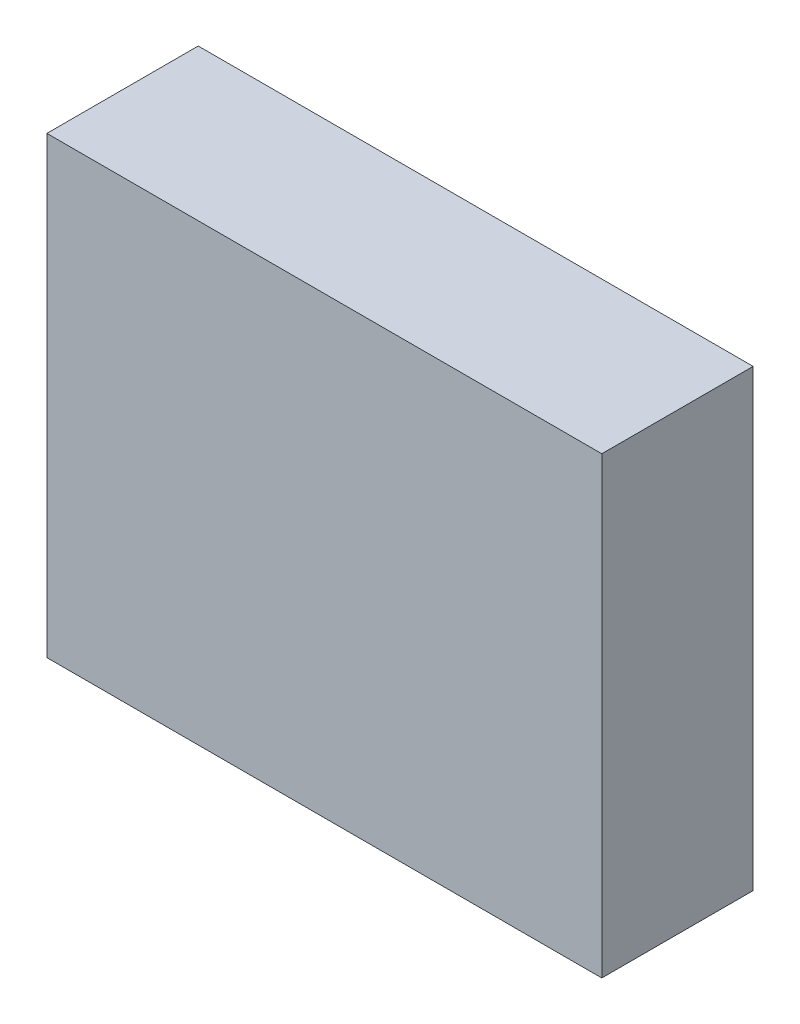
ISO-10303-21;
HEADER;
FILE_DESCRIPTION(('STEP AP214'),'2;1');
FILE_NAME('part.step','',(''),(''),'','','');
FILE_SCHEMA(('AUTOMOTIVE_DESIGN { 1 0 10303 214 1 1 1 1 }'));
ENDSEC;
DATA;
#1=APPLICATION_CONTEXT('core data for automotive mechanical design processes');
#2=APPLICATION_PROTOCOL_DEFINITION('international standard','automotive_design',2000,#1);
#3=PRODUCT_CONTEXT('',#1,'mechanical');
#4=PRODUCT('Part','Part','',(#3));
#5=PRODUCT_RELATED_PRODUCT_CATEGORY('part','',(#4));
#6=PRODUCT_DEFINITION_FORMATION('','',#4);
#7=PRODUCT_DEFINITION_CONTEXT('part definition',#1,'design');
#8=PRODUCT_DEFINITION('design','',#6,#7);
#9=PRODUCT_DEFINITION_SHAPE('','',#8);
#10=(LENGTH_UNIT() NAMED_UNIT(*) SI_UNIT(.MILLI.,.METRE.));
#11=(NAMED_UNIT(*) PLANE_ANGLE_UNIT() SI_UNIT($,.RADIAN.));
#12=(NAMED_UNIT(*) SI_UNIT($,.STERADIAN.) SOLID_ANGLE_UNIT());
#13=UNCERTAINTY_MEASURE_WITH_UNIT(LENGTH_MEASURE(1.E-05),#10,'distance_accuracy_value','');
#14=(GEOMETRIC_REPRESENTATION_CONTEXT(3) GLOBAL_UNCERTAINTY_ASSIGNED_CONTEXT((#13)) GLOBAL_UNIT_ASSIGNED_CONTEXT((#10,
#11,#12)) REPRESENTATION_CONTEXT('',''));
#15=CARTESIAN_POINT('',(0.,0.,0.));
#16=DIRECTION('',(0.,0.,1.));
#17=DIRECTION('',(1.,0.,0.));
#18=AXIS2_PLACEMENT_3D('',#15,#16,#17);
#19=CARTESIAN_POINT('',(1120.,1690.,-700.));
#20=DIRECTION('',(-1.,0.,0.));
#21=DIRECTION('',(0.,0.,1.));
#22=AXIS2_PLACEMENT_3D('',#19,#20,#21);
#23=PLANE('',#22);
#24=DIRECTION('',(0.,-1.,0.));
#25=VECTOR('',#24,1.);
#26=CARTESIAN_POINT('',(1120.,1690.,-670.));
#27=LINE('',#26,#25);
#28=CARTESIAN_POINT('',(1120.,1780.,-670.));
#29=VERTEX_POINT('',#28);
#30=CARTESIAN_POINT('',(1120.,1690.,-670.));
#31=VERTEX_POINT('',#30);
#32=EDGE_CURVE('E103',#29,#31,#27,.T.);
#33=ORIENTED_EDGE('',*,*,#32,.F.);
#34=DIRECTION('',(0.,0.,1.));
#35=VECTOR('',#34,1.);
#36=CARTESIAN_POINT('',(1120.,1780.,-700.));
#37=LINE('',#36,#35);
#38=CARTESIAN_POINT('',(1120.,1780.,-700.));
#39=VERTEX_POINT('',#38);
#40=EDGE_CURVE('E11',#39,#29,#37,.T.);
#41=ORIENTED_EDGE('',*,*,#40,.F.);
#42=DIRECTION('',(0.,-1.,0.));
#43=VECTOR('',#42,1.);
#44=CARTESIAN_POINT('',(1120.,1690.,-700.));
#45=LINE('',#44,#43);
#46=CARTESIAN_POINT('',(1120.,1690.,-700.));
#47=VERTEX_POINT('',#46);
#48=EDGE_CURVE('E97',#39,#47,#45,.T.);
#49=ORIENTED_EDGE('',*,*,#48,.T.);
#50=DIRECTION('',(0.,0.,1.));
#51=VECTOR('',#50,1.);
#52=CARTESIAN_POINT('',(1120.,1690.,-700.));
#53=LINE('',#52,#51);
#54=EDGE_CURVE('E42',#47,#31,#53,.T.);
#55=ORIENTED_EDGE('',*,*,#54,.T.);
#56=EDGE_LOOP('',(#33,#41,#49,#55));
#57=FACE_BOUND('',#56,.T.);
#58=ADVANCED_FACE('F39',(#57),#23,.T.);
#59=CARTESIAN_POINT('',(1120.,1780.,-700.));
#60=DIRECTION('',(0.,1.,0.));
#61=DIRECTION('',(0.,0.,1.));
#62=AXIS2_PLACEMENT_3D('',#59,#60,#61);
#63=PLANE('',#62);
#64=DIRECTION('',(-1.,0.,0.));
#65=VECTOR('',#64,1.);
#66=CARTESIAN_POINT('',(1120.,1780.,-670.));
#67=LINE('',#66,#65);
#68=CARTESIAN_POINT('',(1230.,1780.,-670.));
#69=VERTEX_POINT('',#68);
#70=EDGE_CURVE('E99',#69,#29,#67,.T.);
#71=ORIENTED_EDGE('',*,*,#70,.F.);
#72=DIRECTION('',(0.,0.,1.));
#73=VECTOR('',#72,1.);
#74=CARTESIAN_POINT('',(1230.,1780.,-700.));
#75=LINE('',#74,#73);
#76=CARTESIAN_POINT('',(1230.,1780.,-700.));
#77=VERTEX_POINT('',#76);
#78=EDGE_CURVE('E48',#77,#69,#75,.T.);
#79=ORIENTED_EDGE('',*,*,#78,.F.);
#80=DIRECTION('',(-1.,0.,0.));
#81=VECTOR('',#80,1.);
#82=CARTESIAN_POINT('',(1120.,1780.,-700.));
#83=LINE('',#82,#81);
#84=EDGE_CURVE('E94',#77,#39,#83,.T.);
#85=ORIENTED_EDGE('',*,*,#84,.T.);
#86=ORIENTED_EDGE('',*,*,#40,.T.);
#87=EDGE_LOOP('',(#71,#79,#85,#86));
#88=FACE_BOUND('',#87,.T.);
#89=ADVANCED_FACE('F113',(#88),#63,.T.);
#90=CARTESIAN_POINT('',(1230.,1690.,-700.));
#91=DIRECTION('',(1.,0.,0.));
#92=DIRECTION('',(0.,0.,-1.));
#93=AXIS2_PLACEMENT_3D('',#90,#91,#92);
#94=PLANE('',#93);
#95=DIRECTION('',(0.,1.,0.));
#96=VECTOR('',#95,1.);
#97=CARTESIAN_POINT('',(1230.,1690.,-670.));
#98=LINE('',#97,#96);
#99=CARTESIAN_POINT('',(1230.,1690.,-670.));
#100=VERTEX_POINT('',#99);
#101=EDGE_CURVE('E89',#100,#69,#98,.T.);
#102=ORIENTED_EDGE('',*,*,#101,.F.);
#103=DIRECTION('',(0.,0.,1.));
#104=VECTOR('',#103,1.);
#105=CARTESIAN_POINT('',(1230.,1690.,-700.));
#106=LINE('',#105,#104);
#107=CARTESIAN_POINT('',(1230.,1690.,-700.));
#108=VERTEX_POINT('',#107);
#109=EDGE_CURVE('E84',#108,#100,#106,.T.);
#110=ORIENTED_EDGE('',*,*,#109,.F.);
#111=DIRECTION('',(0.,1.,0.));
#112=VECTOR('',#111,1.);
#113=CARTESIAN_POINT('',(1230.,1690.,-700.));
#114=LINE('',#113,#112);
#115=EDGE_CURVE('E87',#108,#77,#114,.T.);
#116=ORIENTED_EDGE('',*,*,#115,.T.);
#117=ORIENTED_EDGE('',*,*,#78,.T.);
#118=EDGE_LOOP('',(#102,#110,#116,#117));
#119=FACE_BOUND('',#118,.T.);
#120=ADVANCED_FACE('F86',(#119),#94,.T.);
#121=CARTESIAN_POINT('',(1120.,1690.,-700.));
#122=DIRECTION('',(0.,-1.,0.));
#123=DIRECTION('',(0.,0.,-1.));
#124=AXIS2_PLACEMENT_3D('',#121,#122,#123);
#125=PLANE('',#124);
#126=DIRECTION('',(1.,0.,0.));
#127=VECTOR('',#126,1.);
#128=CARTESIAN_POINT('',(1120.,1690.,-670.));
#129=LINE('',#128,#127);
#130=EDGE_CURVE('E106',#31,#100,#129,.T.);
#131=ORIENTED_EDGE('',*,*,#130,.F.);
#132=ORIENTED_EDGE('',*,*,#54,.F.);
#133=DIRECTION('',(1.,0.,0.));
#134=VECTOR('',#133,1.);
#135=CARTESIAN_POINT('',(1120.,1690.,-700.));
#136=LINE('',#135,#134);
#137=EDGE_CURVE('E93',#47,#108,#136,.T.);
#138=ORIENTED_EDGE('',*,*,#137,.T.);
#139=ORIENTED_EDGE('',*,*,#109,.T.);
#140=EDGE_LOOP('',(#131,#132,#138,#139));
#141=FACE_BOUND('',#140,.T.);
#142=ADVANCED_FACE('F96',(#141),#125,.T.);
#143=CARTESIAN_POINT('',(0.,0.,-700.));
#144=DIRECTION('',(0.,0.,-1.));
#145=DIRECTION('',(-1.,0.,0.));
#146=AXIS2_PLACEMENT_3D('',#143,#144,#145);
#147=PLANE('',#146);
#148=ORIENTED_EDGE('',*,*,#48,.F.);
#149=ORIENTED_EDGE('',*,*,#84,.F.);
#150=ORIENTED_EDGE('',*,*,#115,.F.);
#151=ORIENTED_EDGE('',*,*,#137,.F.);
#152=EDGE_LOOP('',(#148,#149,#150,#151));
#153=FACE_BOUND('',#152,.T.);
#154=ADVANCED_FACE('F92',(#153),#147,.T.);
#155=CARTESIAN_POINT('',(0.,0.,-670.));
#156=DIRECTION('',(0.,0.,-1.));
#157=DIRECTION('',(-1.,0.,0.));
#158=AXIS2_PLACEMENT_3D('',#155,#156,#157);
#159=PLANE('',#158);
#160=ORIENTED_EDGE('',*,*,#32,.T.);
#161=ORIENTED_EDGE('',*,*,#130,.T.);
#162=ORIENTED_EDGE('',*,*,#101,.T.);
#163=ORIENTED_EDGE('',*,*,#70,.T.);
#164=EDGE_LOOP('',(#160,#161,#162,#163));
#165=FACE_BOUND('',#164,.T.);
#166=ADVANCED_FACE('F112',(#165),#159,.F.);
#167=CLOSED_SHELL('',(#58,#89,#120,#142,#154,#166));
#168=MANIFOLD_SOLID_BREP('B2',#167);
#169=ADVANCED_BREP_SHAPE_REPRESENTATION('',(#18,#168),#14);
#170=SHAPE_DEFINITION_REPRESENTATION(#9,#169);
ENDSEC;
END-ISO-10303-21;
